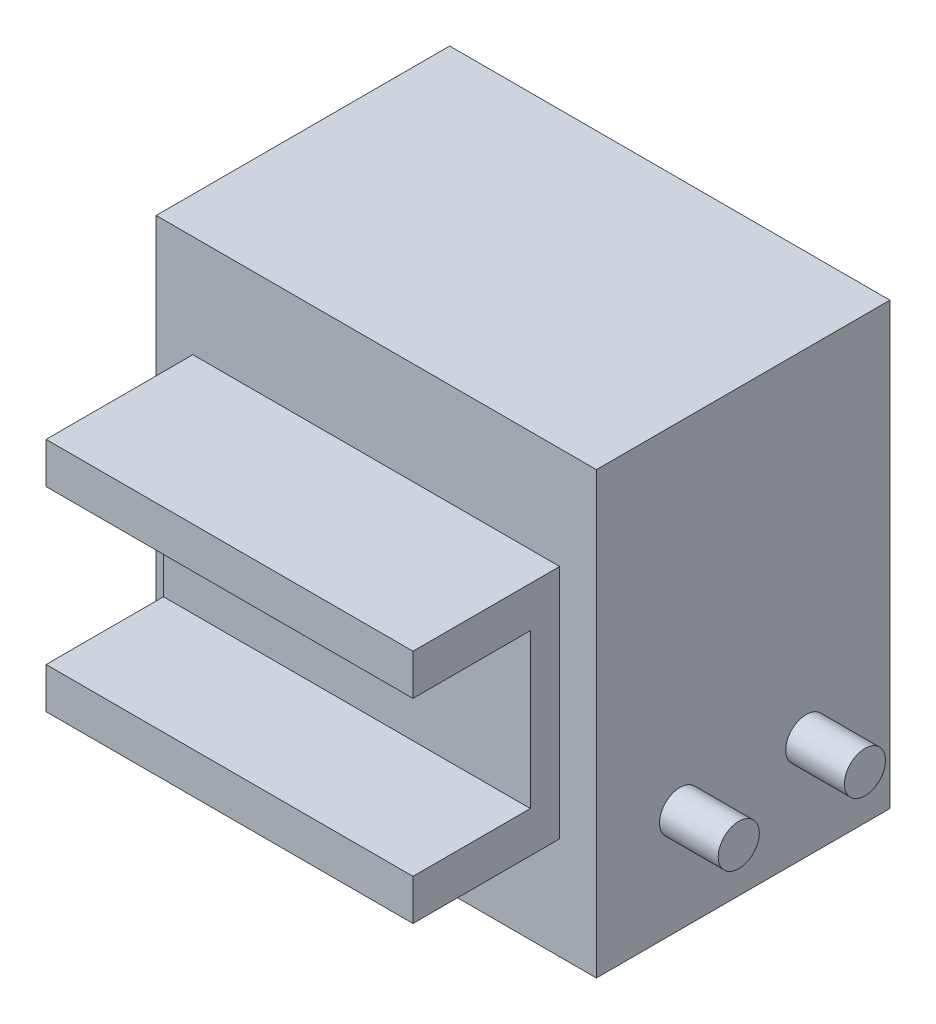
ISO-10303-21;
HEADER;
FILE_DESCRIPTION(('STEP AP214'),'2;1');
FILE_NAME('part.step','',(''),(''),'','','');
FILE_SCHEMA(('AUTOMOTIVE_DESIGN { 1 0 10303 214 1 1 1 1 }'));
ENDSEC;
DATA;
#1=APPLICATION_CONTEXT('core data for automotive mechanical design processes');
#2=APPLICATION_PROTOCOL_DEFINITION('international standard','automotive_design',2000,#1);
#3=PRODUCT_CONTEXT('',#1,'mechanical');
#4=PRODUCT('Part','Part','',(#3));
#5=PRODUCT_RELATED_PRODUCT_CATEGORY('part','',(#4));
#6=PRODUCT_DEFINITION_FORMATION('','',#4);
#7=PRODUCT_DEFINITION_CONTEXT('part definition',#1,'design');
#8=PRODUCT_DEFINITION('design','',#6,#7);
#9=PRODUCT_DEFINITION_SHAPE('','',#8);
#10=(LENGTH_UNIT() NAMED_UNIT(*) SI_UNIT(.MILLI.,.METRE.));
#11=(NAMED_UNIT(*) PLANE_ANGLE_UNIT() SI_UNIT($,.RADIAN.));
#12=(NAMED_UNIT(*) SI_UNIT($,.STERADIAN.) SOLID_ANGLE_UNIT());
#13=UNCERTAINTY_MEASURE_WITH_UNIT(LENGTH_MEASURE(1.E-05),#10,'distance_accuracy_value','');
#14=(GEOMETRIC_REPRESENTATION_CONTEXT(3) GLOBAL_UNCERTAINTY_ASSIGNED_CONTEXT((#13)) GLOBAL_UNIT_ASSIGNED_CONTEXT((#10,
#11,#12)) REPRESENTATION_CONTEXT('',''));
#15=CARTESIAN_POINT('',(0.,0.,0.));
#16=DIRECTION('',(0.,0.,1.));
#17=DIRECTION('',(1.,0.,0.));
#18=AXIS2_PLACEMENT_3D('',#15,#16,#17);
#19=CARTESIAN_POINT('',(0.,0.,17.8164556962025));
#20=DIRECTION('',(0.,0.,1.));
#21=DIRECTION('',(1.,0.,0.));
#22=AXIS2_PLACEMENT_3D('',#19,#20,#21);
#23=PLANE('',#22);
#24=DIRECTION('',(1.,0.,0.));
#25=VECTOR('',#24,1.);
#26=CARTESIAN_POINT('',(0.,9.75,17.8164556962025));
#27=LINE('',#26,#25);
#28=CARTESIAN_POINT('',(-12.8714929223531,9.75,17.8164556962025));
#29=VERTEX_POINT('',#28);
#30=CARTESIAN_POINT('',(12.1285070776469,9.75,17.8164556962025));
#31=VERTEX_POINT('',#30);
#32=EDGE_CURVE('E323',#29,#31,#27,.T.);
#33=ORIENTED_EDGE('',*,*,#32,.F.);
#34=DIRECTION('',(0.,-1.,0.));
#35=VECTOR('',#34,1.);
#36=CARTESIAN_POINT('',(-12.8714929223531,23.035,17.8164556962025));
#37=LINE('',#36,#35);
#38=CARTESIAN_POINT('',(-12.8714929223531,6.965,17.8164556962025));
#39=VERTEX_POINT('',#38);
#40=EDGE_CURVE('E236',#29,#39,#37,.T.);
#41=ORIENTED_EDGE('',*,*,#40,.T.);
#42=DIRECTION('',(1.,0.,0.));
#43=VECTOR('',#42,1.);
#44=CARTESIAN_POINT('',(-12.8714929223531,6.965,17.8164556962025));
#45=LINE('',#44,#43);
#46=CARTESIAN_POINT('',(12.1285070776469,6.965,17.8164556962025));
#47=VERTEX_POINT('',#46);
#48=EDGE_CURVE('E235',#39,#47,#45,.T.);
#49=ORIENTED_EDGE('',*,*,#48,.T.);
#50=DIRECTION('',(0.,1.,0.));
#51=VECTOR('',#50,1.);
#52=CARTESIAN_POINT('',(12.1285070776469,6.965,17.8164556962025));
#53=LINE('',#52,#51);
#54=EDGE_CURVE('E240',#47,#31,#53,.T.);
#55=ORIENTED_EDGE('',*,*,#54,.T.);
#56=EDGE_LOOP('',(#33,#41,#49,#55));
#57=FACE_BOUND('',#56,.T.);
#58=ADVANCED_FACE('F39',(#57),#23,.T.);
#59=CARTESIAN_POINT('',(-15.3714929223531,30.,7.81645569620254));
#60=DIRECTION('',(0.,0.,-1.));
#61=DIRECTION('',(-1.,0.,0.));
#62=AXIS2_PLACEMENT_3D('',#59,#60,#61);
#63=PLANE('',#62);
#64=DIRECTION('',(1.,0.,0.));
#65=VECTOR('',#64,1.);
#66=CARTESIAN_POINT('',(-15.3714929223531,0.,7.81645569620254));
#67=LINE('',#66,#65);
#68=CARTESIAN_POINT('',(-15.3714929223531,0.,7.81645569620254));
#69=VERTEX_POINT('',#68);
#70=CARTESIAN_POINT('',(14.6285070776469,0.,7.81645569620254));
#71=VERTEX_POINT('',#70);
#72=EDGE_CURVE('E297',#69,#71,#67,.T.);
#73=ORIENTED_EDGE('',*,*,#72,.T.);
#74=DIRECTION('',(0.,-1.,0.));
#75=VECTOR('',#74,1.);
#76=CARTESIAN_POINT('',(14.6285070776469,30.,7.81645569620254));
#77=LINE('',#76,#75);
#78=CARTESIAN_POINT('',(14.6285070776469,30.,7.81645569620254));
#79=VERTEX_POINT('',#78);
#80=EDGE_CURVE('E312',#79,#71,#77,.T.);
#81=ORIENTED_EDGE('',*,*,#80,.F.);
#82=DIRECTION('',(1.,0.,0.));
#83=VECTOR('',#82,1.);
#84=CARTESIAN_POINT('',(-15.3714929223531,30.,7.81645569620254));
#85=LINE('',#84,#83);
#86=CARTESIAN_POINT('',(-15.3714929223531,30.,7.81645569620254));
#87=VERTEX_POINT('',#86);
#88=EDGE_CURVE('E283',#87,#79,#85,.T.);
#89=ORIENTED_EDGE('',*,*,#88,.F.);
#90=DIRECTION('',(0.,-1.,0.));
#91=VECTOR('',#90,1.);
#92=CARTESIAN_POINT('',(-15.3714929223531,30.,7.81645569620254));
#93=LINE('',#92,#91);
#94=EDGE_CURVE('E316',#87,#69,#93,.T.);
#95=ORIENTED_EDGE('',*,*,#94,.T.);
#96=EDGE_LOOP('',(#73,#81,#89,#95));
#97=FACE_BOUND('',#96,.T.);
#98=DIRECTION('',(0.,-1.,0.));
#99=VECTOR('',#98,1.);
#100=CARTESIAN_POINT('',(-12.8714929223531,23.035,7.81645569620254));
#101=LINE('',#100,#99);
#102=CARTESIAN_POINT('',(-12.8714929223531,23.035,7.81645569620254));
#103=VERTEX_POINT('',#102);
#104=CARTESIAN_POINT('',(-12.8714929223531,6.965,7.81645569620254));
#105=VERTEX_POINT('',#104);
#106=EDGE_CURVE('E230',#103,#105,#101,.T.);
#107=ORIENTED_EDGE('',*,*,#106,.F.);
#108=DIRECTION('',(-1.,0.,0.));
#109=VECTOR('',#108,1.);
#110=CARTESIAN_POINT('',(12.1285070776469,23.035,7.81645569620254));
#111=LINE('',#110,#109);
#112=CARTESIAN_POINT('',(12.1285070776469,23.035,7.81645569620254));
#113=VERTEX_POINT('',#112);
#114=EDGE_CURVE('E259',#113,#103,#111,.T.);
#115=ORIENTED_EDGE('',*,*,#114,.F.);
#116=DIRECTION('',(0.,1.,0.));
#117=VECTOR('',#116,1.);
#118=CARTESIAN_POINT('',(12.1285070776469,6.965,7.81645569620254));
#119=LINE('',#118,#117);
#120=CARTESIAN_POINT('',(12.1285070776469,6.965,7.81645569620254));
#121=VERTEX_POINT('',#120);
#122=EDGE_CURVE('E255',#121,#113,#119,.T.);
#123=ORIENTED_EDGE('',*,*,#122,.F.);
#124=DIRECTION('',(1.,0.,0.));
#125=VECTOR('',#124,1.);
#126=CARTESIAN_POINT('',(-12.8714929223531,6.965,7.81645569620254));
#127=LINE('',#126,#125);
#128=EDGE_CURVE('E251',#105,#121,#127,.T.);
#129=ORIENTED_EDGE('',*,*,#128,.F.);
#130=EDGE_LOOP('',(#107,#115,#123,#129));
#131=FACE_BOUND('',#130,.T.);
#132=ADVANCED_FACE('F363',(#97,#131),#63,.F.);
#133=CARTESIAN_POINT('',(-15.3714929223531,30.,-12.1835443037975));
#134=DIRECTION('',(1.,0.,0.));
#135=DIRECTION('',(0.,0.,-1.));
#136=AXIS2_PLACEMENT_3D('',#133,#134,#135);
#137=PLANE('',#136);
#138=DIRECTION('',(0.,0.,1.));
#139=VECTOR('',#138,1.);
#140=CARTESIAN_POINT('',(-15.3714929223531,2.,6.31645569620254));
#141=LINE('',#140,#139);
#142=CARTESIAN_POINT('',(-15.3714929223531,2.,-10.6835443037975));
#143=VERTEX_POINT('',#142);
#144=CARTESIAN_POINT('',(-15.3714929223531,2.,6.31645569620254));
#145=VERTEX_POINT('',#144);
#146=EDGE_CURVE('E193',#143,#145,#141,.T.);
#147=ORIENTED_EDGE('',*,*,#146,.F.);
#148=DIRECTION('',(0.,-1.,0.));
#149=VECTOR('',#148,1.);
#150=CARTESIAN_POINT('',(-15.3714929223531,2.,-10.6835443037975));
#151=LINE('',#150,#149);
#152=CARTESIAN_POINT('',(-15.3714929223531,28.,-10.6835443037975));
#153=VERTEX_POINT('',#152);
#154=EDGE_CURVE('E55',#153,#143,#151,.T.);
#155=ORIENTED_EDGE('',*,*,#154,.F.);
#156=DIRECTION('',(0.,0.,-1.));
#157=VECTOR('',#156,1.);
#158=CARTESIAN_POINT('',(-15.3714929223531,28.,-10.6835443037975));
#159=LINE('',#158,#157);
#160=CARTESIAN_POINT('',(-15.3714929223531,28.,6.31645569620253));
#161=VERTEX_POINT('',#160);
#162=EDGE_CURVE('E177',#161,#153,#159,.T.);
#163=ORIENTED_EDGE('',*,*,#162,.F.);
#164=DIRECTION('',(0.,1.,0.));
#165=VECTOR('',#164,1.);
#166=CARTESIAN_POINT('',(-15.3714929223531,28.,6.31645569620253));
#167=LINE('',#166,#165);
#168=EDGE_CURVE('E181',#145,#161,#167,.T.);
#169=ORIENTED_EDGE('',*,*,#168,.F.);
#170=EDGE_LOOP('',(#147,#155,#163,#169));
#171=FACE_BOUND('',#170,.T.);
#172=DIRECTION('',(0.,0.,1.));
#173=VECTOR('',#172,1.);
#174=CARTESIAN_POINT('',(-15.3714929223531,0.,-12.1835443037975));
#175=LINE('',#174,#173);
#176=CARTESIAN_POINT('',(-15.3714929223531,0.,-12.1835443037975));
#177=VERTEX_POINT('',#176);
#178=EDGE_CURVE('E278',#177,#69,#175,.T.);
#179=ORIENTED_EDGE('',*,*,#178,.T.);
#180=ORIENTED_EDGE('',*,*,#94,.F.);
#181=DIRECTION('',(0.,0.,1.));
#182=VECTOR('',#181,1.);
#183=CARTESIAN_POINT('',(-15.3714929223531,30.,-12.1835443037975));
#184=LINE('',#183,#182);
#185=CARTESIAN_POINT('',(-15.3714929223531,30.,-12.1835443037975));
#186=VERTEX_POINT('',#185);
#187=EDGE_CURVE('E279',#186,#87,#184,.T.);
#188=ORIENTED_EDGE('',*,*,#187,.F.);
#189=DIRECTION('',(0.,-1.,0.));
#190=VECTOR('',#189,1.);
#191=CARTESIAN_POINT('',(-15.3714929223531,30.,-12.1835443037975));
#192=LINE('',#191,#190);
#193=EDGE_CURVE('E293',#186,#177,#192,.T.);
#194=ORIENTED_EDGE('',*,*,#193,.T.);
#195=EDGE_LOOP('',(#179,#180,#188,#194));
#196=FACE_BOUND('',#195,.T.);
#197=ADVANCED_FACE('F41',(#171,#196),#137,.F.);
#198=CARTESIAN_POINT('',(14.6285070776469,30.,-12.1835443037975));
#199=DIRECTION('',(-1.,0.,0.));
#200=DIRECTION('',(0.,0.,1.));
#201=AXIS2_PLACEMENT_3D('',#198,#199,#200);
#202=PLANE('',#201);
#203=CARTESIAN_POINT('',(14.6285070776469,7.,-6.48354430379747));
#204=DIRECTION('',(-1.,0.,0.));
#205=DIRECTION('',(0.,0.,1.));
#206=AXIS2_PLACEMENT_3D('',#203,#204,#205);
#207=CIRCLE('',#206,1.4);
#208=CARTESIAN_POINT('',(14.6285070776469,7.,-5.08354430379747));
#209=VERTEX_POINT('',#208);
#210=EDGE_CURVE('E334',#209,#209,#207,.F.);
#211=ORIENTED_EDGE('',*,*,#210,.F.);
#212=EDGE_LOOP('',(#211));
#213=FACE_BOUND('',#212,.T.);
#214=CARTESIAN_POINT('',(14.6285070776469,7.,2.11645569620253));
#215=DIRECTION('',(-1.,0.,0.));
#216=DIRECTION('',(0.,0.,1.));
#217=AXIS2_PLACEMENT_3D('',#214,#215,#216);
#218=CIRCLE('',#217,1.4);
#219=CARTESIAN_POINT('',(14.6285070776469,7.,3.51645569620253));
#220=VERTEX_POINT('',#219);
#221=EDGE_CURVE('E330',#220,#220,#218,.F.);
#222=ORIENTED_EDGE('',*,*,#221,.F.);
#223=EDGE_LOOP('',(#222));
#224=FACE_BOUND('',#223,.T.);
#225=DIRECTION('',(0.,0.,-1.));
#226=VECTOR('',#225,1.);
#227=CARTESIAN_POINT('',(14.6285070776469,0.,-12.1835443037975));
#228=LINE('',#227,#226);
#229=CARTESIAN_POINT('',(14.6285070776469,0.,-12.1835443037975));
#230=VERTEX_POINT('',#229);
#231=EDGE_CURVE('E300',#71,#230,#228,.T.);
#232=ORIENTED_EDGE('',*,*,#231,.T.);
#233=DIRECTION('',(0.,-1.,0.));
#234=VECTOR('',#233,1.);
#235=CARTESIAN_POINT('',(14.6285070776469,30.,-12.1835443037975));
#236=LINE('',#235,#234);
#237=CARTESIAN_POINT('',(14.6285070776469,30.,-12.1835443037975));
#238=VERTEX_POINT('',#237);
#239=EDGE_CURVE('E308',#238,#230,#236,.T.);
#240=ORIENTED_EDGE('',*,*,#239,.F.);
#241=DIRECTION('',(0.,0.,-1.));
#242=VECTOR('',#241,1.);
#243=CARTESIAN_POINT('',(14.6285070776469,30.,-12.1835443037975));
#244=LINE('',#243,#242);
#245=EDGE_CURVE('E287',#79,#238,#244,.T.);
#246=ORIENTED_EDGE('',*,*,#245,.F.);
#247=ORIENTED_EDGE('',*,*,#80,.T.);
#248=EDGE_LOOP('',(#232,#240,#246,#247));
#249=FACE_BOUND('',#248,.T.);
#250=ADVANCED_FACE('F347',(#213,#224,#249),#202,.F.);
#251=CARTESIAN_POINT('',(-15.3714929223531,30.,-12.1835443037975));
#252=DIRECTION('',(0.,0.,1.));
#253=DIRECTION('',(1.,0.,0.));
#254=AXIS2_PLACEMENT_3D('',#251,#252,#253);
#255=PLANE('',#254);
#256=CARTESIAN_POINT('',(-4.67149292235307,7.,-12.1835443037975));
#257=DIRECTION('',(0.,0.,1.));
#258=DIRECTION('',(1.,0.,0.));
#259=AXIS2_PLACEMENT_3D('',#256,#257,#258);
#260=CIRCLE('',#259,1.4);
#261=CARTESIAN_POINT('',(-3.27149292235307,7.,-12.1835443037975));
#262=VERTEX_POINT('',#261);
#263=EDGE_CURVE('E11',#262,#262,#260,.F.);
#264=ORIENTED_EDGE('',*,*,#263,.F.);
#265=EDGE_LOOP('',(#264));
#266=FACE_BOUND('',#265,.T.);
#267=CARTESIAN_POINT('',(3.92850707764693,7.,-12.1835443037975));
#268=DIRECTION('',(0.,0.,1.));
#269=DIRECTION('',(1.,0.,0.));
#270=AXIS2_PLACEMENT_3D('',#267,#268,#269);
#271=CIRCLE('',#270,1.4);
#272=CARTESIAN_POINT('',(5.32850707764693,7.,-12.1835443037975));
#273=VERTEX_POINT('',#272);
#274=EDGE_CURVE('E48',#273,#273,#271,.F.);
#275=ORIENTED_EDGE('',*,*,#274,.F.);
#276=EDGE_LOOP('',(#275));
#277=FACE_BOUND('',#276,.T.);
#278=DIRECTION('',(-1.,0.,0.));
#279=VECTOR('',#278,1.);
#280=CARTESIAN_POINT('',(-15.3714929223531,0.,-12.1835443037975));
#281=LINE('',#280,#279);
#282=EDGE_CURVE('E284',#230,#177,#281,.T.);
#283=ORIENTED_EDGE('',*,*,#282,.T.);
#284=ORIENTED_EDGE('',*,*,#193,.F.);
#285=DIRECTION('',(-1.,0.,0.));
#286=VECTOR('',#285,1.);
#287=CARTESIAN_POINT('',(-15.3714929223531,30.,-12.1835443037975));
#288=LINE('',#287,#286);
#289=EDGE_CURVE('E290',#238,#186,#288,.T.);
#290=ORIENTED_EDGE('',*,*,#289,.F.);
#291=ORIENTED_EDGE('',*,*,#239,.T.);
#292=EDGE_LOOP('',(#283,#284,#290,#291));
#293=FACE_BOUND('',#292,.T.);
#294=ADVANCED_FACE('F343',(#266,#277,#293),#255,.F.);
#295=CARTESIAN_POINT('',(0.,30.,0.));
#296=DIRECTION('',(0.,1.,0.));
#297=DIRECTION('',(0.,0.,1.));
#298=AXIS2_PLACEMENT_3D('',#295,#296,#297);
#299=PLANE('',#298);
#300=ORIENTED_EDGE('',*,*,#187,.T.);
#301=ORIENTED_EDGE('',*,*,#88,.T.);
#302=ORIENTED_EDGE('',*,*,#245,.T.);
#303=ORIENTED_EDGE('',*,*,#289,.T.);
#304=EDGE_LOOP('',(#300,#301,#302,#303));
#305=FACE_BOUND('',#304,.T.);
#306=ADVANCED_FACE('F346',(#305),#299,.T.);
#307=CARTESIAN_POINT('',(0.,0.,0.));
#308=DIRECTION('',(0.,1.,0.));
#309=DIRECTION('',(0.,0.,1.));
#310=AXIS2_PLACEMENT_3D('',#307,#308,#309);
#311=PLANE('',#310);
#312=ORIENTED_EDGE('',*,*,#178,.F.);
#313=ORIENTED_EDGE('',*,*,#282,.F.);
#314=ORIENTED_EDGE('',*,*,#231,.F.);
#315=ORIENTED_EDGE('',*,*,#72,.F.);
#316=EDGE_LOOP('',(#312,#313,#314,#315));
#317=FACE_BOUND('',#316,.T.);
#318=ADVANCED_FACE('F360',(#317),#311,.F.);
#319=CARTESIAN_POINT('',(-12.8714929223531,23.035,17.8164556962025));
#320=DIRECTION('',(1.,0.,0.));
#321=DIRECTION('',(0.,1.,0.));
#322=AXIS2_PLACEMENT_3D('',#319,#320,#321);
#323=PLANE('',#322);
#324=ORIENTED_EDGE('',*,*,#40,.F.);
#325=DIRECTION('',(0.,0.,1.));
#326=VECTOR('',#325,1.);
#327=CARTESIAN_POINT('',(-12.8714929223531,9.75,9.81645569620254));
#328=LINE('',#327,#326);
#329=CARTESIAN_POINT('',(-12.8714929223531,9.75,9.81645569620254));
#330=VERTEX_POINT('',#329);
#331=EDGE_CURVE('E215',#330,#29,#328,.T.);
#332=ORIENTED_EDGE('',*,*,#331,.F.);
#333=DIRECTION('',(0.,-1.,0.));
#334=VECTOR('',#333,1.);
#335=CARTESIAN_POINT('',(-12.8714929223531,20.25,9.81645569620254));
#336=LINE('',#335,#334);
#337=CARTESIAN_POINT('',(-12.8714929223531,20.25,9.81645569620254));
#338=VERTEX_POINT('',#337);
#339=EDGE_CURVE('E211',#338,#330,#336,.T.);
#340=ORIENTED_EDGE('',*,*,#339,.F.);
#341=DIRECTION('',(0.,0.,-1.));
#342=VECTOR('',#341,1.);
#343=CARTESIAN_POINT('',(-12.8714929223531,20.25,17.8164556962025));
#344=LINE('',#343,#342);
#345=CARTESIAN_POINT('',(-12.8714929223531,20.25,17.8164556962025));
#346=VERTEX_POINT('',#345);
#347=EDGE_CURVE('E202',#346,#338,#344,.T.);
#348=ORIENTED_EDGE('',*,*,#347,.F.);
#349=CARTESIAN_POINT('',(-12.8714929223531,23.035,17.8164556962025));
#350=VERTEX_POINT('',#349);
#351=EDGE_CURVE('E231',#350,#346,#37,.T.);
#352=ORIENTED_EDGE('',*,*,#351,.F.);
#353=DIRECTION('',(0.,0.,-1.));
#354=VECTOR('',#353,1.);
#355=CARTESIAN_POINT('',(-12.8714929223531,23.035,17.8164556962025));
#356=LINE('',#355,#354);
#357=EDGE_CURVE('E247',#350,#103,#356,.T.);
#358=ORIENTED_EDGE('',*,*,#357,.T.);
#359=ORIENTED_EDGE('',*,*,#106,.T.);
#360=DIRECTION('',(0.,0.,-1.));
#361=VECTOR('',#360,1.);
#362=CARTESIAN_POINT('',(-12.8714929223531,6.965,17.8164556962025));
#363=LINE('',#362,#361);
#364=EDGE_CURVE('E274',#39,#105,#363,.T.);
#365=ORIENTED_EDGE('',*,*,#364,.F.);
#366=EDGE_LOOP('',(#324,#332,#340,#348,#352,#358,#359,#365));
#367=FACE_BOUND('',#366,.T.);
#368=ADVANCED_FACE('F419',(#367),#323,.F.);
#369=CARTESIAN_POINT('',(-12.8714929223531,6.965,17.8164556962025));
#370=DIRECTION('',(0.,1.,0.));
#371=DIRECTION('',(-1.,0.,0.));
#372=AXIS2_PLACEMENT_3D('',#369,#370,#371);
#373=PLANE('',#372);
#374=ORIENTED_EDGE('',*,*,#128,.T.);
#375=DIRECTION('',(0.,0.,-1.));
#376=VECTOR('',#375,1.);
#377=CARTESIAN_POINT('',(12.1285070776469,6.965,17.8164556962025));
#378=LINE('',#377,#376);
#379=EDGE_CURVE('E270',#47,#121,#378,.T.);
#380=ORIENTED_EDGE('',*,*,#379,.F.);
#381=ORIENTED_EDGE('',*,*,#48,.F.);
#382=ORIENTED_EDGE('',*,*,#364,.T.);
#383=EDGE_LOOP('',(#374,#380,#381,#382));
#384=FACE_BOUND('',#383,.T.);
#385=ADVANCED_FACE('F417',(#384),#373,.F.);
#386=CARTESIAN_POINT('',(12.1285070776469,6.965,17.8164556962025));
#387=DIRECTION('',(-1.,0.,0.));
#388=DIRECTION('',(0.,0.,1.));
#389=AXIS2_PLACEMENT_3D('',#386,#387,#388);
#390=PLANE('',#389);
#391=DIRECTION('',(0.,-1.,0.));
#392=VECTOR('',#391,1.);
#393=CARTESIAN_POINT('',(12.1285070776469,6.965,9.81645569620254));
#394=LINE('',#393,#392);
#395=CARTESIAN_POINT('',(12.1285070776469,20.25,9.81645569620254));
#396=VERTEX_POINT('',#395);
#397=CARTESIAN_POINT('',(12.1285070776469,9.75,9.81645569620254));
#398=VERTEX_POINT('',#397);
#399=EDGE_CURVE('E326',#396,#398,#394,.T.);
#400=ORIENTED_EDGE('',*,*,#399,.T.);
#401=DIRECTION('',(0.,0.,1.));
#402=VECTOR('',#401,1.);
#403=CARTESIAN_POINT('',(12.1285070776469,9.75,17.8164556962025));
#404=LINE('',#403,#402);
#405=EDGE_CURVE('E226',#398,#31,#404,.T.);
#406=ORIENTED_EDGE('',*,*,#405,.T.);
#407=ORIENTED_EDGE('',*,*,#54,.F.);
#408=ORIENTED_EDGE('',*,*,#379,.T.);
#409=ORIENTED_EDGE('',*,*,#122,.T.);
#410=DIRECTION('',(0.,0.,-1.));
#411=VECTOR('',#410,1.);
#412=CARTESIAN_POINT('',(12.1285070776469,23.035,17.8164556962025));
#413=LINE('',#412,#411);
#414=CARTESIAN_POINT('',(12.1285070776469,23.035,17.8164556962025));
#415=VERTEX_POINT('',#414);
#416=EDGE_CURVE('E266',#415,#113,#413,.T.);
#417=ORIENTED_EDGE('',*,*,#416,.F.);
#418=CARTESIAN_POINT('',(12.1285070776469,20.25,17.8164556962025));
#419=VERTEX_POINT('',#418);
#420=EDGE_CURVE('E239',#419,#415,#53,.T.);
#421=ORIENTED_EDGE('',*,*,#420,.F.);
#422=DIRECTION('',(0.,0.,-1.));
#423=VECTOR('',#422,1.);
#424=CARTESIAN_POINT('',(12.1285070776469,20.25,17.8164556962025));
#425=LINE('',#424,#423);
#426=EDGE_CURVE('E63',#419,#396,#425,.T.);
#427=ORIENTED_EDGE('',*,*,#426,.T.);
#428=EDGE_LOOP('',(#400,#406,#407,#408,#409,#417,#421,#427));
#429=FACE_BOUND('',#428,.T.);
#430=ADVANCED_FACE('F400',(#429),#390,.F.);
#431=CARTESIAN_POINT('',(12.1285070776469,23.035,17.8164556962025));
#432=DIRECTION('',(0.,-1.,0.));
#433=DIRECTION('',(0.,0.,-1.));
#434=AXIS2_PLACEMENT_3D('',#431,#432,#433);
#435=PLANE('',#434);
#436=ORIENTED_EDGE('',*,*,#114,.T.);
#437=ORIENTED_EDGE('',*,*,#357,.F.);
#438=DIRECTION('',(-1.,0.,0.));
#439=VECTOR('',#438,1.);
#440=CARTESIAN_POINT('',(12.1285070776469,23.035,17.8164556962025));
#441=LINE('',#440,#439);
#442=EDGE_CURVE('E244',#415,#350,#441,.T.);
#443=ORIENTED_EDGE('',*,*,#442,.F.);
#444=ORIENTED_EDGE('',*,*,#416,.T.);
#445=EDGE_LOOP('',(#436,#437,#443,#444));
#446=FACE_BOUND('',#445,.T.);
#447=ADVANCED_FACE('F391',(#446),#435,.F.);
#448=DIRECTION('',(-1.,0.,0.));
#449=VECTOR('',#448,1.);
#450=CARTESIAN_POINT('',(0.,20.25,17.8164556962025));
#451=LINE('',#450,#449);
#452=EDGE_CURVE('E320',#419,#346,#451,.T.);
#453=ORIENTED_EDGE('',*,*,#452,.F.);
#454=ORIENTED_EDGE('',*,*,#420,.T.);
#455=ORIENTED_EDGE('',*,*,#442,.T.);
#456=ORIENTED_EDGE('',*,*,#351,.T.);
#457=EDGE_LOOP('',(#453,#454,#455,#456));
#458=FACE_BOUND('',#457,.T.);
#459=ADVANCED_FACE('F382',(#458),#23,.T.);
#460=CARTESIAN_POINT('',(14.6285070776469,20.25,9.81645569620254));
#461=DIRECTION('',(0.,0.,-1.));
#462=DIRECTION('',(-1.,0.,0.));
#463=AXIS2_PLACEMENT_3D('',#460,#461,#462);
#464=PLANE('',#463);
#465=DIRECTION('',(-1.,0.,0.));
#466=VECTOR('',#465,1.);
#467=CARTESIAN_POINT('',(14.6285070776469,20.25,9.81645569620254));
#468=LINE('',#467,#466);
#469=EDGE_CURVE('E218',#396,#338,#468,.T.);
#470=ORIENTED_EDGE('',*,*,#469,.T.);
#471=ORIENTED_EDGE('',*,*,#339,.T.);
#472=DIRECTION('',(-1.,0.,0.));
#473=VECTOR('',#472,1.);
#474=CARTESIAN_POINT('',(14.6285070776469,9.75,9.81645569620254));
#475=LINE('',#474,#473);
#476=EDGE_CURVE('E219',#398,#330,#475,.T.);
#477=ORIENTED_EDGE('',*,*,#476,.F.);
#478=ORIENTED_EDGE('',*,*,#399,.F.);
#479=EDGE_LOOP('',(#470,#471,#477,#478));
#480=FACE_BOUND('',#479,.T.);
#481=ADVANCED_FACE('F390',(#480),#464,.F.);
#482=CARTESIAN_POINT('',(14.6285070776469,9.75,9.81645569620254));
#483=DIRECTION('',(0.,-1.,0.));
#484=DIRECTION('',(1.,0.,0.));
#485=AXIS2_PLACEMENT_3D('',#482,#483,#484);
#486=PLANE('',#485);
#487=ORIENTED_EDGE('',*,*,#476,.T.);
#488=ORIENTED_EDGE('',*,*,#331,.T.);
#489=ORIENTED_EDGE('',*,*,#32,.T.);
#490=ORIENTED_EDGE('',*,*,#405,.F.);
#491=EDGE_LOOP('',(#487,#488,#489,#490));
#492=FACE_BOUND('',#491,.T.);
#493=ADVANCED_FACE('F397',(#492),#486,.F.);
#494=CARTESIAN_POINT('',(14.6285070776469,20.25,17.8164556962025));
#495=DIRECTION('',(0.,1.,0.));
#496=DIRECTION('',(-1.,0.,0.));
#497=AXIS2_PLACEMENT_3D('',#494,#495,#496);
#498=PLANE('',#497);
#499=ORIENTED_EDGE('',*,*,#452,.T.);
#500=ORIENTED_EDGE('',*,*,#347,.T.);
#501=ORIENTED_EDGE('',*,*,#469,.F.);
#502=ORIENTED_EDGE('',*,*,#426,.F.);
#503=EDGE_LOOP('',(#499,#500,#501,#502));
#504=FACE_BOUND('',#503,.T.);
#505=ADVANCED_FACE('F422',(#504),#498,.F.);
#506=CARTESIAN_POINT('',(9.62850707764693,2.,-10.6835443037975));
#507=DIRECTION('',(0.,0.,-1.));
#508=DIRECTION('',(-1.,0.,0.));
#509=AXIS2_PLACEMENT_3D('',#506,#507,#508);
#510=PLANE('',#509);
#511=ORIENTED_EDGE('',*,*,#154,.T.);
#512=DIRECTION('',(-1.,0.,0.));
#513=VECTOR('',#512,1.);
#514=CARTESIAN_POINT('',(9.62850707764693,2.,-10.6835443037975));
#515=LINE('',#514,#513);
#516=CARTESIAN_POINT('',(9.62850707764693,2.,-10.6835443037975));
#517=VERTEX_POINT('',#516);
#518=EDGE_CURVE('E152',#517,#143,#515,.T.);
#519=ORIENTED_EDGE('',*,*,#518,.F.);
#520=DIRECTION('',(0.,-1.,0.));
#521=VECTOR('',#520,1.);
#522=CARTESIAN_POINT('',(9.62850707764693,2.,-10.6835443037975));
#523=LINE('',#522,#521);
#524=CARTESIAN_POINT('',(9.62850707764693,28.,-10.6835443037975));
#525=VERTEX_POINT('',#524);
#526=EDGE_CURVE('E156',#525,#517,#523,.T.);
#527=ORIENTED_EDGE('',*,*,#526,.F.);
#528=DIRECTION('',(-1.,0.,0.));
#529=VECTOR('',#528,1.);
#530=CARTESIAN_POINT('',(9.62850707764693,28.,-10.6835443037975));
#531=LINE('',#530,#529);
#532=EDGE_CURVE('E199',#525,#153,#531,.T.);
#533=ORIENTED_EDGE('',*,*,#532,.T.);
#534=EDGE_LOOP('',(#511,#519,#527,#533));
#535=FACE_BOUND('',#534,.T.);
#536=ADVANCED_FACE('F154',(#535),#510,.F.);
#537=CARTESIAN_POINT('',(9.62850707764693,28.,-10.6835443037975));
#538=DIRECTION('',(0.,1.,0.));
#539=DIRECTION('',(0.,0.,1.));
#540=AXIS2_PLACEMENT_3D('',#537,#538,#539);
#541=PLANE('',#540);
#542=ORIENTED_EDGE('',*,*,#162,.T.);
#543=ORIENTED_EDGE('',*,*,#532,.F.);
#544=DIRECTION('',(0.,0.,-1.));
#545=VECTOR('',#544,1.);
#546=CARTESIAN_POINT('',(9.62850707764693,28.,-10.6835443037975));
#547=LINE('',#546,#545);
#548=CARTESIAN_POINT('',(9.62850707764694,28.,6.31645569620253));
#549=VERTEX_POINT('',#548);
#550=EDGE_CURVE('E163',#549,#525,#547,.T.);
#551=ORIENTED_EDGE('',*,*,#550,.F.);
#552=DIRECTION('',(-1.,0.,0.));
#553=VECTOR('',#552,1.);
#554=CARTESIAN_POINT('',(9.62850707764694,28.,6.31645569620253));
#555=LINE('',#554,#553);
#556=EDGE_CURVE('E203',#549,#161,#555,.T.);
#557=ORIENTED_EDGE('',*,*,#556,.T.);
#558=EDGE_LOOP('',(#542,#543,#551,#557));
#559=FACE_BOUND('',#558,.T.);
#560=ADVANCED_FACE('F433',(#559),#541,.F.);
#561=CARTESIAN_POINT('',(9.62850707764694,28.,6.31645569620253));
#562=DIRECTION('',(0.,0.,1.));
#563=DIRECTION('',(1.,0.,0.));
#564=AXIS2_PLACEMENT_3D('',#561,#562,#563);
#565=PLANE('',#564);
#566=ORIENTED_EDGE('',*,*,#168,.T.);
#567=ORIENTED_EDGE('',*,*,#556,.F.);
#568=DIRECTION('',(0.,1.,0.));
#569=VECTOR('',#568,1.);
#570=CARTESIAN_POINT('',(9.62850707764694,28.,6.31645569620253));
#571=LINE('',#570,#569);
#572=CARTESIAN_POINT('',(9.62850707764694,2.,6.31645569620253));
#573=VERTEX_POINT('',#572);
#574=EDGE_CURVE('E172',#573,#549,#571,.T.);
#575=ORIENTED_EDGE('',*,*,#574,.F.);
#576=DIRECTION('',(-1.,0.,0.));
#577=VECTOR('',#576,1.);
#578=CARTESIAN_POINT('',(9.62850707764694,2.,6.31645569620253));
#579=LINE('',#578,#577);
#580=EDGE_CURVE('E162',#573,#145,#579,.T.);
#581=ORIENTED_EDGE('',*,*,#580,.T.);
#582=EDGE_LOOP('',(#566,#567,#575,#581));
#583=FACE_BOUND('',#582,.T.);
#584=ADVANCED_FACE('F436',(#583),#565,.F.);
#585=CARTESIAN_POINT('',(9.62850707764694,2.,6.31645569620253));
#586=DIRECTION('',(0.,-1.,0.));
#587=DIRECTION('',(0.,0.,-1.));
#588=AXIS2_PLACEMENT_3D('',#585,#586,#587);
#589=PLANE('',#588);
#590=ORIENTED_EDGE('',*,*,#146,.T.);
#591=ORIENTED_EDGE('',*,*,#580,.F.);
#592=DIRECTION('',(0.,0.,1.));
#593=VECTOR('',#592,1.);
#594=CARTESIAN_POINT('',(9.62850707764694,2.,6.31645569620253));
#595=LINE('',#594,#593);
#596=EDGE_CURVE('E166',#517,#573,#595,.T.);
#597=ORIENTED_EDGE('',*,*,#596,.F.);
#598=ORIENTED_EDGE('',*,*,#518,.T.);
#599=EDGE_LOOP('',(#590,#591,#597,#598));
#600=FACE_BOUND('',#599,.T.);
#601=ADVANCED_FACE('F167',(#600),#589,.F.);
#602=CARTESIAN_POINT('',(9.62850707764693,0.,0.));
#603=DIRECTION('',(1.,0.,0.));
#604=DIRECTION('',(0.,0.,-1.));
#605=AXIS2_PLACEMENT_3D('',#602,#603,#604);
#606=PLANE('',#605);
#607=ORIENTED_EDGE('',*,*,#526,.T.);
#608=ORIENTED_EDGE('',*,*,#596,.T.);
#609=ORIENTED_EDGE('',*,*,#574,.T.);
#610=ORIENTED_EDGE('',*,*,#550,.T.);
#611=EDGE_LOOP('',(#607,#608,#609,#610));
#612=FACE_BOUND('',#611,.T.);
#613=ADVANCED_FACE('F174',(#612),#606,.F.);
#614=CARTESIAN_POINT('',(18.6285070776469,7.,2.11645569620253));
#615=DIRECTION('',(-1.,0.,0.));
#616=DIRECTION('',(0.,0.,1.));
#617=AXIS2_PLACEMENT_3D('',#614,#615,#616);
#618=CYLINDRICAL_SURFACE('',#617,1.4);
#619=CARTESIAN_POINT('',(18.6285070776469,7.,2.11645569620253));
#620=DIRECTION('',(1.,0.,0.));
#621=DIRECTION('',(0.,0.,-1.));
#622=AXIS2_PLACEMENT_3D('',#619,#620,#621);
#623=CIRCLE('',#622,1.4);
#624=CARTESIAN_POINT('',(18.6285070776469,7.,0.716455696202533));
#625=VERTEX_POINT('',#624);
#626=EDGE_CURVE('E184',#625,#625,#623,.T.);
#627=ORIENTED_EDGE('',*,*,#626,.F.);
#628=EDGE_LOOP('',(#627));
#629=FACE_BOUND('',#628,.T.);
#630=ORIENTED_EDGE('',*,*,#221,.T.);
#631=EDGE_LOOP('',(#630));
#632=FACE_BOUND('',#631,.T.);
#633=ADVANCED_FACE('F445',(#629,#632),#618,.T.);
#634=CARTESIAN_POINT('',(18.6285070776469,7.,2.11645569620253));
#635=DIRECTION('',(1.,0.,0.));
#636=DIRECTION('',(0.,0.,-1.));
#637=AXIS2_PLACEMENT_3D('',#634,#635,#636);
#638=PLANE('',#637);
#639=ORIENTED_EDGE('',*,*,#626,.T.);
#640=EDGE_LOOP('',(#639));
#641=FACE_BOUND('',#640,.T.);
#642=ADVANCED_FACE('F448',(#641),#638,.T.);
#643=CARTESIAN_POINT('',(18.6285070776469,7.,-6.48354430379747));
#644=DIRECTION('',(-1.,0.,0.));
#645=DIRECTION('',(0.,0.,1.));
#646=AXIS2_PLACEMENT_3D('',#643,#644,#645);
#647=CYLINDRICAL_SURFACE('',#646,1.4);
#648=CARTESIAN_POINT('',(18.6285070776469,7.,-6.48354430379747));
#649=DIRECTION('',(1.,0.,0.));
#650=DIRECTION('',(0.,0.,-1.));
#651=AXIS2_PLACEMENT_3D('',#648,#649,#650);
#652=CIRCLE('',#651,1.4);
#653=CARTESIAN_POINT('',(18.6285070776469,7.,-7.88354430379747));
#654=VERTEX_POINT('',#653);
#655=EDGE_CURVE('E485',#654,#654,#652,.T.);
#656=ORIENTED_EDGE('',*,*,#655,.F.);
#657=EDGE_LOOP('',(#656));
#658=FACE_BOUND('',#657,.T.);
#659=ORIENTED_EDGE('',*,*,#210,.T.);
#660=EDGE_LOOP('',(#659));
#661=FACE_BOUND('',#660,.T.);
#662=ADVANCED_FACE('F452',(#658,#661),#647,.T.);
#663=CARTESIAN_POINT('',(18.6285070776469,7.,-6.48354430379747));
#664=DIRECTION('',(1.,0.,0.));
#665=DIRECTION('',(0.,0.,-1.));
#666=AXIS2_PLACEMENT_3D('',#663,#664,#665);
#667=PLANE('',#666);
#668=ORIENTED_EDGE('',*,*,#655,.T.);
#669=EDGE_LOOP('',(#668));
#670=FACE_BOUND('',#669,.T.);
#671=ADVANCED_FACE('F456',(#670),#667,.T.);
#672=CARTESIAN_POINT('',(3.92850707764693,7.,-16.1835443037975));
#673=DIRECTION('',(0.,0.,1.));
#674=DIRECTION('',(1.,0.,0.));
#675=AXIS2_PLACEMENT_3D('',#672,#673,#674);
#676=CYLINDRICAL_SURFACE('',#675,1.4);
#677=CARTESIAN_POINT('',(3.92850707764693,7.,-16.1835443037975));
#678=DIRECTION('',(0.,0.,-1.));
#679=DIRECTION('',(-1.,0.,0.));
#680=AXIS2_PLACEMENT_3D('',#677,#678,#679);
#681=CIRCLE('',#680,1.4);
#682=CARTESIAN_POINT('',(2.52850707764693,7.,-16.1835443037975));
#683=VERTEX_POINT('',#682);
#684=EDGE_CURVE('E481',#683,#683,#681,.T.);
#685=ORIENTED_EDGE('',*,*,#684,.F.);
#686=EDGE_LOOP('',(#685));
#687=FACE_BOUND('',#686,.T.);
#688=ORIENTED_EDGE('',*,*,#274,.T.);
#689=EDGE_LOOP('',(#688));
#690=FACE_BOUND('',#689,.T.);
#691=ADVANCED_FACE('F341',(#687,#690),#676,.T.);
#692=CARTESIAN_POINT('',(3.92850707764693,7.,-16.1835443037975));
#693=DIRECTION('',(0.,0.,-1.));
#694=DIRECTION('',(-1.,0.,0.));
#695=AXIS2_PLACEMENT_3D('',#692,#693,#694);
#696=PLANE('',#695);
#697=ORIENTED_EDGE('',*,*,#684,.T.);
#698=EDGE_LOOP('',(#697));
#699=FACE_BOUND('',#698,.T.);
#700=ADVANCED_FACE('F463',(#699),#696,.T.);
#701=CARTESIAN_POINT('',(-4.67149292235307,7.,-16.1835443037975));
#702=DIRECTION('',(0.,0.,1.));
#703=DIRECTION('',(1.,0.,0.));
#704=AXIS2_PLACEMENT_3D('',#701,#702,#703);
#705=CYLINDRICAL_SURFACE('',#704,1.4);
#706=CARTESIAN_POINT('',(-4.67149292235307,7.,-16.1835443037975));
#707=DIRECTION('',(0.,0.,-1.));
#708=DIRECTION('',(-1.,0.,0.));
#709=AXIS2_PLACEMENT_3D('',#706,#707,#708);
#710=CIRCLE('',#709,1.4);
#711=CARTESIAN_POINT('',(-6.07149292235307,7.,-16.1835443037975));
#712=VERTEX_POINT('',#711);
#713=EDGE_CURVE('E479',#712,#712,#710,.T.);
#714=ORIENTED_EDGE('',*,*,#713,.F.);
#715=EDGE_LOOP('',(#714));
#716=FACE_BOUND('',#715,.T.);
#717=ORIENTED_EDGE('',*,*,#263,.T.);
#718=EDGE_LOOP('',(#717));
#719=FACE_BOUND('',#718,.T.);
#720=ADVANCED_FACE('F467',(#716,#719),#705,.T.);
#721=CARTESIAN_POINT('',(-4.67149292235307,7.,-16.1835443037975));
#722=DIRECTION('',(0.,0.,-1.));
#723=DIRECTION('',(-1.,0.,0.));
#724=AXIS2_PLACEMENT_3D('',#721,#722,#723);
#725=PLANE('',#724);
#726=ORIENTED_EDGE('',*,*,#713,.T.);
#727=EDGE_LOOP('',(#726));
#728=FACE_BOUND('',#727,.T.);
#729=ADVANCED_FACE('F471',(#728),#725,.T.);
#730=CLOSED_SHELL('',(#58,#132,#197,#250,#294,#306,#318,#368,#385,#430,#447,#459,#481,#493,#505,
#536,#560,#584,#601,#613,#633,#642,#662,#671,#691,#700,#720,#729));
#731=MANIFOLD_SOLID_BREP('B2',#730);
#732=ADVANCED_BREP_SHAPE_REPRESENTATION('',(#18,#731),#14);
#733=SHAPE_DEFINITION_REPRESENTATION(#9,#732);
ENDSEC;
END-ISO-10303-21;
